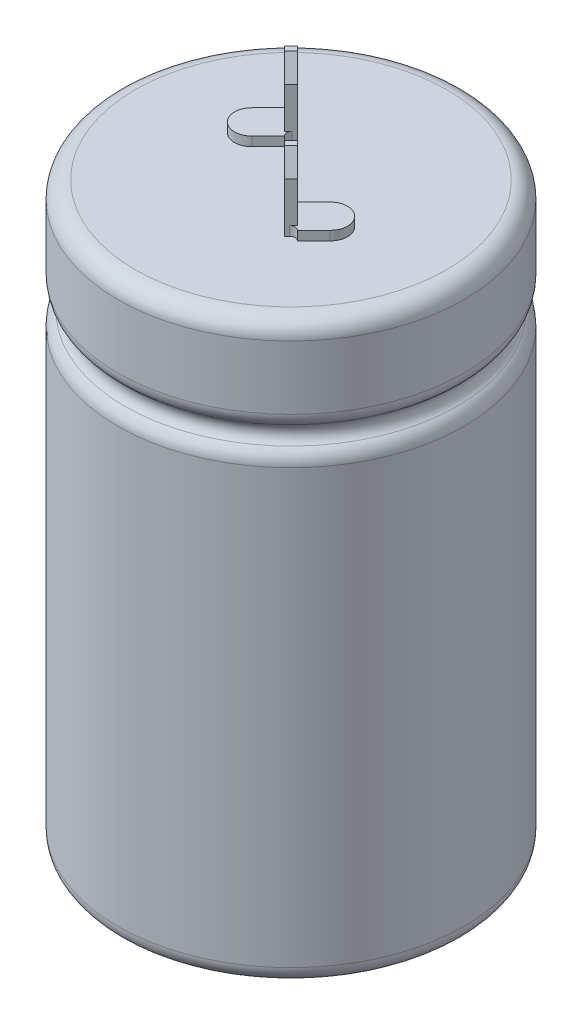
ISO-10303-21;
HEADER;
FILE_DESCRIPTION(('STEP AP214'),'2;1');
FILE_NAME('part.step','',(''),(''),'','','');
FILE_SCHEMA(('AUTOMOTIVE_DESIGN { 1 0 10303 214 1 1 1 1 }'));
ENDSEC;
DATA;
#1=APPLICATION_CONTEXT('core data for automotive mechanical design processes');
#2=APPLICATION_PROTOCOL_DEFINITION('international standard','automotive_design',2000,#1);
#3=PRODUCT_CONTEXT('',#1,'mechanical');
#4=PRODUCT('Part','Part','',(#3));
#5=PRODUCT_RELATED_PRODUCT_CATEGORY('part','',(#4));
#6=PRODUCT_DEFINITION_FORMATION('','',#4);
#7=PRODUCT_DEFINITION_CONTEXT('part definition',#1,'design');
#8=PRODUCT_DEFINITION('design','',#6,#7);
#9=PRODUCT_DEFINITION_SHAPE('','',#8);
#10=(LENGTH_UNIT() NAMED_UNIT(*) SI_UNIT(.MILLI.,.METRE.));
#11=(NAMED_UNIT(*) PLANE_ANGLE_UNIT() SI_UNIT($,.RADIAN.));
#12=(NAMED_UNIT(*) SI_UNIT($,.STERADIAN.) SOLID_ANGLE_UNIT());
#13=UNCERTAINTY_MEASURE_WITH_UNIT(LENGTH_MEASURE(1.E-05),#10,'distance_accuracy_value','');
#14=(GEOMETRIC_REPRESENTATION_CONTEXT(3) GLOBAL_UNCERTAINTY_ASSIGNED_CONTEXT((#13)) GLOBAL_UNIT_ASSIGNED_CONTEXT((#10,
#11,#12)) REPRESENTATION_CONTEXT('',''));
#15=CARTESIAN_POINT('',(0.,0.,0.));
#16=DIRECTION('',(0.,0.,1.));
#17=DIRECTION('',(1.,0.,0.));
#18=AXIS2_PLACEMENT_3D('',#15,#16,#17);
#19=CARTESIAN_POINT('',(4.52548339959411,56.3,3.95979797464446));
#20=DIRECTION('',(-0.707106781186544,0.,0.707106781186551));
#21=DIRECTION('',(0.707106781186551,0.,0.707106781186544));
#22=AXIS2_PLACEMENT_3D('',#19,#20,#21);
#23=PLANE('',#22);
#24=DIRECTION('',(-0.707106781186551,0.,-0.707106781186544));
#25=VECTOR('',#24,1.);
#26=CARTESIAN_POINT('',(4.52548339959411,56.3,3.95979797464446));
#27=LINE('',#26,#25);
#28=CARTESIAN_POINT('',(4.01075175799472,56.3,3.44506633304508));
#29=VERTEX_POINT('',#28);
#30=CARTESIAN_POINT('',(3.62600147882039,56.3,3.06031605387075));
#31=VERTEX_POINT('',#30);
#32=EDGE_CURVE('E265',#29,#31,#27,.T.);
#33=ORIENTED_EDGE('',*,*,#32,.F.);
#34=DIRECTION('',(0.241844762647975,-0.939692620785909,0.241844762647973));
#35=VECTOR('',#34,1.);
#36=CARTESIAN_POINT('',(4.01075175799472,56.3,3.44506633304508));
#37=LINE('',#36,#35);
#38=CARTESIAN_POINT('',(4.52548339959411,54.3,3.95979797464446));
#39=VERTEX_POINT('',#38);
#40=EDGE_CURVE('E344',#29,#39,#37,.T.);
#41=ORIENTED_EDGE('',*,*,#40,.T.);
#42=DIRECTION('',(0.,-1.,0.));
#43=VECTOR('',#42,1.);
#44=CARTESIAN_POINT('',(4.52548339959411,56.3,3.95979797464446));
#45=LINE('',#44,#43);
#46=CARTESIAN_POINT('',(4.52548339959414,50.8,3.95979797464443));
#47=VERTEX_POINT('',#46);
#48=EDGE_CURVE('E285',#39,#47,#45,.T.);
#49=ORIENTED_EDGE('',*,*,#48,.T.);
#50=DIRECTION('',(0.707106781186557,0.,0.707106781186538));
#51=VECTOR('',#50,1.);
#52=CARTESIAN_POINT('',(4.87903679018742,50.8,4.31335136523769));
#53=LINE('',#52,#51);
#54=CARTESIAN_POINT('',(3.11126983722103,50.8,2.54558441227135));
#55=VERTEX_POINT('',#54);
#56=EDGE_CURVE('E203',#55,#47,#53,.T.);
#57=ORIENTED_EDGE('',*,*,#56,.F.);
#58=DIRECTION('',(0.,-1.,0.));
#59=VECTOR('',#58,1.);
#60=CARTESIAN_POINT('',(3.11126983722101,56.3,2.54558441227137));
#61=LINE('',#60,#59);
#62=CARTESIAN_POINT('',(3.11126983722101,54.3,2.54558441227137));
#63=VERTEX_POINT('',#62);
#64=EDGE_CURVE('E283',#63,#55,#61,.T.);
#65=ORIENTED_EDGE('',*,*,#64,.F.);
#66=DIRECTION('',(0.241844762647976,0.939692620785909,0.241844762647974));
#67=VECTOR('',#66,1.);
#68=CARTESIAN_POINT('',(3.62600147882039,56.3,3.06031605387075));
#69=LINE('',#68,#67);
#70=EDGE_CURVE('E342',#63,#31,#69,.T.);
#71=ORIENTED_EDGE('',*,*,#70,.T.);
#72=EDGE_LOOP('',(#33,#41,#49,#57,#65,#71));
#73=FACE_BOUND('',#72,.T.);
#74=ADVANCED_FACE('F33',(#73),#23,.F.);
#75=CARTESIAN_POINT('',(-15.,50.,0.));
#76=DIRECTION('',(0.,-1.,0.));
#77=DIRECTION('',(0.,0.,-1.));
#78=AXIS2_PLACEMENT_3D('',#75,#76,#77);
#79=PLANE('',#78);
#80=DIRECTION('',(-0.707106781186544,0.,0.707106781186551));
#81=VECTOR('',#80,1.);
#82=CARTESIAN_POINT('',(2.54558441227177,50.,3.11126983722061));
#83=LINE('',#82,#81);
#84=CARTESIAN_POINT('',(2.75771644662775,50.,2.89913780286463));
#85=VERTEX_POINT('',#84);
#86=CARTESIAN_POINT('',(2.54558441227177,50.,3.11126983722061));
#87=VERTEX_POINT('',#86);
#88=EDGE_CURVE('E275',#85,#87,#83,.T.);
#89=ORIENTED_EDGE('',*,*,#88,.F.);
#90=CARTESIAN_POINT('',(2.40416305603448,50.,2.54558441227136));
#91=DIRECTION('',(0.,-1.,0.));
#92=DIRECTION('',(0.,0.,-1.));
#93=AXIS2_PLACEMENT_3D('',#90,#91,#92);
#94=CIRCLE('',#93,0.5);
#95=CARTESIAN_POINT('',(2.75771644662775,50.,2.19203102167808));
#96=VERTEX_POINT('',#95);
#97=EDGE_CURVE('E379',#85,#96,#94,.F.);
#98=ORIENTED_EDGE('',*,*,#97,.T.);
#99=DIRECTION('',(-0.707106781186538,0.,0.707106781186557));
#100=VECTOR('',#99,1.);
#101=CARTESIAN_POINT('',(2.75771644662775,50.,2.19203102167808));
#102=LINE('',#101,#100);
#103=CARTESIAN_POINT('',(4.17193000900083,50.,0.77781745930497));
#104=VERTEX_POINT('',#103);
#105=EDGE_CURVE('E211',#104,#96,#102,.T.);
#106=ORIENTED_EDGE('',*,*,#105,.F.);
#107=CARTESIAN_POINT('',(5.23259018078064,50.,1.8384776310848));
#108=DIRECTION('',(0.,1.,0.));
#109=DIRECTION('',(0.,0.,-1.));
#110=AXIS2_PLACEMENT_3D('',#107,#108,#109);
#111=CIRCLE('',#110,1.5);
#112=CARTESIAN_POINT('',(6.29325035256049,50.,2.89913780286458));
#113=VERTEX_POINT('',#112);
#114=EDGE_CURVE('E204',#113,#104,#111,.T.);
#115=ORIENTED_EDGE('',*,*,#114,.F.);
#116=DIRECTION('',(0.707106781186538,0.,-0.707106781186557));
#117=VECTOR('',#116,1.);
#118=CARTESIAN_POINT('',(4.87903679018742,50.,4.31335136523769));
#119=LINE('',#118,#117);
#120=CARTESIAN_POINT('',(4.87903679018742,50.,4.31335136523769));
#121=VERTEX_POINT('',#120);
#122=EDGE_CURVE('E421',#121,#113,#119,.T.);
#123=ORIENTED_EDGE('',*,*,#122,.F.);
#124=CARTESIAN_POINT('',(4.52548339959415,50.,4.66690475583097));
#125=DIRECTION('',(0.,-1.,0.));
#126=DIRECTION('',(0.,0.,-1.));
#127=AXIS2_PLACEMENT_3D('',#124,#125,#126);
#128=CIRCLE('',#127,0.5);
#129=CARTESIAN_POINT('',(4.17193000900087,50.,4.3133513652377));
#130=VERTEX_POINT('',#129);
#131=EDGE_CURVE('E377',#121,#130,#128,.F.);
#132=ORIENTED_EDGE('',*,*,#131,.T.);
#133=DIRECTION('',(0.707106781186543,0.,-0.707106781186552));
#134=VECTOR('',#133,1.);
#135=CARTESIAN_POINT('',(3.95979797464487,50.,4.5254833995937));
#136=LINE('',#135,#134);
#137=CARTESIAN_POINT('',(3.95979797464487,50.,4.5254833995937));
#138=VERTEX_POINT('',#137);
#139=EDGE_CURVE('E264',#138,#130,#136,.T.);
#140=ORIENTED_EDGE('',*,*,#139,.F.);
#141=DIRECTION('',(0.707106781186551,0.,0.707106781186544));
#142=VECTOR('',#141,1.);
#143=CARTESIAN_POINT('',(3.95979797464487,50.,4.5254833995937));
#144=LINE('',#143,#142);
#145=EDGE_CURVE('E269',#87,#138,#144,.T.);
#146=ORIENTED_EDGE('',*,*,#145,.F.);
#147=EDGE_LOOP('',(#89,#98,#106,#115,#123,#132,#140,#146));
#148=FACE_BOUND('',#147,.T.);
#149=CARTESIAN_POINT('',(0.,50.,0.));
#150=DIRECTION('',(0.,-1.,0.));
#151=DIRECTION('',(0.,0.,-1.));
#152=AXIS2_PLACEMENT_3D('',#149,#150,#151);
#153=CIRCLE('',#152,13.5);
#154=CARTESIAN_POINT('',(0.,50.,-13.5));
#155=VERTEX_POINT('',#154);
#156=EDGE_CURVE('E333',#155,#155,#153,.F.);
#157=ORIENTED_EDGE('',*,*,#156,.T.);
#158=EDGE_LOOP('',(#157));
#159=FACE_BOUND('',#158,.T.);
#160=DIRECTION('',(-0.707106781186503,0.,0.707106781186592));
#161=VECTOR('',#160,1.);
#162=CARTESIAN_POINT('',(-4.87903679018725,50.,-4.31335136523786));
#163=LINE('',#162,#161);
#164=CARTESIAN_POINT('',(-4.87903679018725,50.,-4.31335136523786));
#165=VERTEX_POINT('',#164);
#166=CARTESIAN_POINT('',(-6.29325035256026,50.,-2.89913780286467));
#167=VERTEX_POINT('',#166);
#168=EDGE_CURVE('E213',#165,#167,#163,.T.);
#169=ORIENTED_EDGE('',*,*,#168,.F.);
#170=CARTESIAN_POINT('',(-4.52548339959398,50.,-4.66690475583114));
#171=DIRECTION('',(0.,-1.,0.));
#172=DIRECTION('',(0.,0.,-1.));
#173=AXIS2_PLACEMENT_3D('',#170,#171,#172);
#174=CIRCLE('',#173,0.5);
#175=CARTESIAN_POINT('',(-4.17193000900071,50.,-4.31335136523786));
#176=VERTEX_POINT('',#175);
#177=EDGE_CURVE('E249',#165,#176,#174,.F.);
#178=ORIENTED_EDGE('',*,*,#177,.T.);
#179=DIRECTION('',(-0.707106781186543,0.,0.707106781186552));
#180=VECTOR('',#179,1.);
#181=CARTESIAN_POINT('',(-4.52548339959393,50.,-3.95979797464464));
#182=LINE('',#181,#180);
#183=CARTESIAN_POINT('',(-3.95979797464469,50.,-4.52548339959388));
#184=VERTEX_POINT('',#183);
#185=EDGE_CURVE('E288',#184,#176,#182,.T.);
#186=ORIENTED_EDGE('',*,*,#185,.F.);
#187=DIRECTION('',(-0.707106781186551,0.,-0.707106781186544));
#188=VECTOR('',#187,1.);
#189=CARTESIAN_POINT('',(-3.95979797464469,50.,-4.52548339959388));
#190=LINE('',#189,#188);
#191=CARTESIAN_POINT('',(-2.54558441227159,50.,-3.1112698372208));
#192=VERTEX_POINT('',#191);
#193=EDGE_CURVE('E293',#192,#184,#190,.T.);
#194=ORIENTED_EDGE('',*,*,#193,.F.);
#195=DIRECTION('',(0.707106781186544,0.,-0.707106781186551));
#196=VECTOR('',#195,1.);
#197=CARTESIAN_POINT('',(-3.11126983722082,50.,-2.54558441227155));
#198=LINE('',#197,#196);
#199=CARTESIAN_POINT('',(-2.7577164466275,50.,-2.89913780286489));
#200=VERTEX_POINT('',#199);
#201=EDGE_CURVE('E299',#200,#192,#198,.T.);
#202=ORIENTED_EDGE('',*,*,#201,.F.);
#203=CARTESIAN_POINT('',(-2.40416305603422,50.,-2.54558441227161));
#204=DIRECTION('',(0.,-1.,0.));
#205=DIRECTION('',(0.,0.,-1.));
#206=AXIS2_PLACEMENT_3D('',#203,#204,#205);
#207=CIRCLE('',#206,0.5);
#208=CARTESIAN_POINT('',(-2.75771644662749,50.,-2.19203102167834));
#209=VERTEX_POINT('',#208);
#210=EDGE_CURVE('E374',#200,#209,#207,.F.);
#211=ORIENTED_EDGE('',*,*,#210,.T.);
#212=DIRECTION('',(0.70710678118651,0.,-0.707106781186584));
#213=VECTOR('',#212,1.);
#214=CARTESIAN_POINT('',(-2.75771644662749,50.,-2.19203102167834));
#215=LINE('',#214,#213);
#216=CARTESIAN_POINT('',(-4.17193000900052,50.,-0.777817459305164));
#217=VERTEX_POINT('',#216);
#218=EDGE_CURVE('E246',#217,#209,#215,.T.);
#219=ORIENTED_EDGE('',*,*,#218,.F.);
#220=CARTESIAN_POINT('',(-5.23259018078039,50.,-1.83847763108492));
#221=DIRECTION('',(0.,1.,0.));
#222=DIRECTION('',(0.,0.,1.));
#223=AXIS2_PLACEMENT_3D('',#220,#221,#222);
#224=CIRCLE('',#223,1.49999999999999);
#225=EDGE_CURVE('E407',#167,#217,#224,.T.);
#226=ORIENTED_EDGE('',*,*,#225,.F.);
#227=EDGE_LOOP('',(#169,#178,#186,#194,#202,#211,#219,#226));
#228=FACE_BOUND('',#227,.T.);
#229=ADVANCED_FACE('F400',(#148,#159,#228),#79,.F.);
#230=CARTESIAN_POINT('',(0.,0.,0.));
#231=DIRECTION('',(0.,-1.,0.));
#232=DIRECTION('',(0.,0.,-1.));
#233=AXIS2_PLACEMENT_3D('',#230,#231,#232);
#234=CYLINDRICAL_SURFACE('',#233,15.);
#235=CARTESIAN_POINT('',(0.,43.,0.));
#236=DIRECTION('',(0.,1.,0.));
#237=DIRECTION('',(0.,0.,1.));
#238=AXIS2_PLACEMENT_3D('',#235,#236,#237);
#239=CIRCLE('',#238,15.);
#240=CARTESIAN_POINT('',(0.,43.,15.));
#241=VERTEX_POINT('',#240);
#242=EDGE_CURVE('E321',#241,#241,#239,.T.);
#243=ORIENTED_EDGE('',*,*,#242,.T.);
#244=EDGE_LOOP('',(#243));
#245=FACE_BOUND('',#244,.T.);
#246=CARTESIAN_POINT('',(0.,48.5,0.));
#247=DIRECTION('',(0.,-1.,0.));
#248=DIRECTION('',(0.,0.,-1.));
#249=AXIS2_PLACEMENT_3D('',#246,#247,#248);
#250=CIRCLE('',#249,15.);
#251=CARTESIAN_POINT('',(0.,48.5,-15.));
#252=VERTEX_POINT('',#251);
#253=EDGE_CURVE('E318',#252,#252,#250,.T.);
#254=ORIENTED_EDGE('',*,*,#253,.T.);
#255=EDGE_LOOP('',(#254));
#256=FACE_BOUND('',#255,.T.);
#257=ADVANCED_FACE('F484',(#245,#256),#234,.T.);
#258=CARTESIAN_POINT('',(0.,41.,0.));
#259=DIRECTION('',(0.,-1.,0.));
#260=DIRECTION('',(0.,0.,-1.));
#261=AXIS2_PLACEMENT_3D('',#258,#259,#260);
#262=TOROIDAL_SURFACE('',#261,15.,0.999999999999997);
#263=CARTESIAN_POINT('',(0.,41.8,0.));
#264=DIRECTION('',(0.,-1.,0.));
#265=DIRECTION('',(0.,0.,-1.));
#266=AXIS2_PLACEMENT_3D('',#263,#264,#265);
#267=CIRCLE('',#266,14.4);
#268=CARTESIAN_POINT('',(0.,41.8,-14.4));
#269=VERTEX_POINT('',#268);
#270=EDGE_CURVE('E315',#269,#269,#267,.T.);
#271=ORIENTED_EDGE('',*,*,#270,.T.);
#272=EDGE_LOOP('',(#271));
#273=FACE_BOUND('',#272,.T.);
#274=CARTESIAN_POINT('',(0.,40.2,0.));
#275=DIRECTION('',(0.,1.,0.));
#276=DIRECTION('',(0.,0.,1.));
#277=AXIS2_PLACEMENT_3D('',#274,#275,#276);
#278=CIRCLE('',#277,14.4);
#279=CARTESIAN_POINT('',(0.,40.2,14.4));
#280=VERTEX_POINT('',#279);
#281=EDGE_CURVE('E312',#280,#280,#278,.T.);
#282=ORIENTED_EDGE('',*,*,#281,.T.);
#283=EDGE_LOOP('',(#282));
#284=FACE_BOUND('',#283,.T.);
#285=ADVANCED_FACE('F518',(#273,#284),#262,.F.);
#286=CARTESIAN_POINT('',(0.,0.,0.));
#287=DIRECTION('',(0.,-1.,0.));
#288=DIRECTION('',(0.,0.,-1.));
#289=AXIS2_PLACEMENT_3D('',#286,#287,#288);
#290=CYLINDRICAL_SURFACE('',#289,15.);
#291=CARTESIAN_POINT('',(0.,39.,0.));
#292=DIRECTION('',(0.,1.,0.));
#293=DIRECTION('',(0.,0.,1.));
#294=AXIS2_PLACEMENT_3D('',#291,#292,#293);
#295=CIRCLE('',#294,15.);
#296=CARTESIAN_POINT('',(0.,39.,15.));
#297=VERTEX_POINT('',#296);
#298=EDGE_CURVE('E327',#297,#297,#295,.F.);
#299=ORIENTED_EDGE('',*,*,#298,.T.);
#300=EDGE_LOOP('',(#299));
#301=FACE_BOUND('',#300,.T.);
#302=CARTESIAN_POINT('',(0.,1.5,0.));
#303=DIRECTION('',(0.,1.,0.));
#304=DIRECTION('',(0.,0.,1.));
#305=AXIS2_PLACEMENT_3D('',#302,#303,#304);
#306=CIRCLE('',#305,15.);
#307=CARTESIAN_POINT('',(0.,1.5,15.));
#308=VERTEX_POINT('',#307);
#309=EDGE_CURVE('E324',#308,#308,#306,.T.);
#310=ORIENTED_EDGE('',*,*,#309,.T.);
#311=EDGE_LOOP('',(#310));
#312=FACE_BOUND('',#311,.T.);
#313=ADVANCED_FACE('F514',(#301,#312),#290,.T.);
#314=CARTESIAN_POINT('',(0.,0.,0.));
#315=DIRECTION('',(0.,1.,0.));
#316=DIRECTION('',(0.,0.,1.));
#317=AXIS2_PLACEMENT_3D('',#314,#315,#316);
#318=PLANE('',#317);
#319=CARTESIAN_POINT('',(0.,0.,0.));
#320=DIRECTION('',(0.,1.,0.));
#321=DIRECTION('',(0.,0.,1.));
#322=AXIS2_PLACEMENT_3D('',#319,#320,#321);
#323=CIRCLE('',#322,13.5);
#324=CARTESIAN_POINT('',(0.,0.,13.5));
#325=VERTEX_POINT('',#324);
#326=EDGE_CURVE('E330',#325,#325,#323,.F.);
#327=ORIENTED_EDGE('',*,*,#326,.T.);
#328=EDGE_LOOP('',(#327));
#329=FACE_BOUND('',#328,.T.);
#330=ADVANCED_FACE('F510',(#329),#318,.F.);
#331=CARTESIAN_POINT('',(0.,43.,0.));
#332=DIRECTION('',(0.,1.,0.));
#333=DIRECTION('',(0.,0.,1.));
#334=AXIS2_PLACEMENT_3D('',#331,#332,#333);
#335=TOROIDAL_SURFACE('',#334,13.5,1.5);
#336=ORIENTED_EDGE('',*,*,#242,.F.);
#337=EDGE_LOOP('',(#336));
#338=FACE_BOUND('',#337,.T.);
#339=ORIENTED_EDGE('',*,*,#270,.F.);
#340=EDGE_LOOP('',(#339));
#341=FACE_BOUND('',#340,.T.);
#342=ADVANCED_FACE('F513',(#338,#341),#335,.T.);
#343=CARTESIAN_POINT('',(0.,39.,0.));
#344=DIRECTION('',(0.,1.,0.));
#345=DIRECTION('',(0.,0.,1.));
#346=AXIS2_PLACEMENT_3D('',#343,#344,#345);
#347=TOROIDAL_SURFACE('',#346,13.5,1.5);
#348=ORIENTED_EDGE('',*,*,#281,.F.);
#349=EDGE_LOOP('',(#348));
#350=FACE_BOUND('',#349,.T.);
#351=ORIENTED_EDGE('',*,*,#298,.F.);
#352=EDGE_LOOP('',(#351));
#353=FACE_BOUND('',#352,.T.);
#354=ADVANCED_FACE('F528',(#350,#353),#347,.T.);
#355=CARTESIAN_POINT('',(0.,1.5,0.));
#356=DIRECTION('',(0.,1.,0.));
#357=DIRECTION('',(0.,0.,1.));
#358=AXIS2_PLACEMENT_3D('',#355,#356,#357);
#359=TOROIDAL_SURFACE('',#358,13.5,1.5);
#360=ORIENTED_EDGE('',*,*,#309,.F.);
#361=EDGE_LOOP('',(#360));
#362=FACE_BOUND('',#361,.T.);
#363=ORIENTED_EDGE('',*,*,#326,.F.);
#364=EDGE_LOOP('',(#363));
#365=FACE_BOUND('',#364,.T.);
#366=ADVANCED_FACE('F532',(#362,#365),#359,.T.);
#367=CARTESIAN_POINT('',(0.,48.5,0.));
#368=DIRECTION('',(0.,-1.,0.));
#369=DIRECTION('',(0.,0.,-1.));
#370=AXIS2_PLACEMENT_3D('',#367,#368,#369);
#371=TOROIDAL_SURFACE('',#370,13.5,1.5);
#372=ORIENTED_EDGE('',*,*,#156,.F.);
#373=EDGE_LOOP('',(#372));
#374=FACE_BOUND('',#373,.T.);
#375=ORIENTED_EDGE('',*,*,#253,.F.);
#376=EDGE_LOOP('',(#375));
#377=FACE_BOUND('',#376,.T.);
#378=ADVANCED_FACE('F508',(#374,#377),#371,.T.);
#379=CARTESIAN_POINT('',(-4.52548339959393,56.3,-3.95979797464464));
#380=DIRECTION('',(0.707106781186552,0.,0.707106781186543));
#381=DIRECTION('',(0.707106781186543,0.,-0.707106781186552));
#382=AXIS2_PLACEMENT_3D('',#379,#380,#381);
#383=PLANE('',#382);
#384=ORIENTED_EDGE('',*,*,#185,.T.);
#385=DIRECTION('',(0.,-1.,0.));
#386=VECTOR('',#385,1.);
#387=CARTESIAN_POINT('',(-4.17193000900071,50.8,-4.31335136523786));
#388=LINE('',#387,#386);
#389=CARTESIAN_POINT('',(-4.17193000900071,50.8,-4.31335136523786));
#390=VERTEX_POINT('',#389);
#391=EDGE_CURVE('E387',#176,#390,#388,.F.);
#392=ORIENTED_EDGE('',*,*,#391,.T.);
#393=DIRECTION('',(-0.707106781186543,0.,0.707106781186552));
#394=VECTOR('',#393,1.);
#395=CARTESIAN_POINT('',(-4.52548339959393,50.8,-3.95979797464464));
#396=LINE('',#395,#394);
#397=CARTESIAN_POINT('',(-4.52548339959396,50.8,-3.95979797464461));
#398=VERTEX_POINT('',#397);
#399=EDGE_CURVE('E233',#390,#398,#396,.T.);
#400=ORIENTED_EDGE('',*,*,#399,.T.);
#401=DIRECTION('',(0.,-1.,0.));
#402=VECTOR('',#401,1.);
#403=CARTESIAN_POINT('',(-4.52548339959393,56.3,-3.95979797464464));
#404=LINE('',#403,#402);
#405=CARTESIAN_POINT('',(-4.52548339959393,54.3,-3.95979797464464));
#406=VERTEX_POINT('',#405);
#407=EDGE_CURVE('E309',#406,#398,#404,.T.);
#408=ORIENTED_EDGE('',*,*,#407,.F.);
#409=DIRECTION('',(0.707106781186543,0.,-0.707106781186552));
#410=VECTOR('',#409,1.);
#411=CARTESIAN_POINT('',(-4.52548339959393,54.3,-3.95979797464464));
#412=LINE('',#411,#410);
#413=CARTESIAN_POINT('',(-3.95979797464469,54.3,-4.52548339959388));
#414=VERTEX_POINT('',#413);
#415=EDGE_CURVE('E364',#406,#414,#412,.T.);
#416=ORIENTED_EDGE('',*,*,#415,.T.);
#417=DIRECTION('',(0.,-1.,0.));
#418=VECTOR('',#417,1.);
#419=CARTESIAN_POINT('',(-3.95979797464469,56.3,-4.52548339959388));
#420=LINE('',#419,#418);
#421=EDGE_CURVE('E296',#414,#184,#420,.T.);
#422=ORIENTED_EDGE('',*,*,#421,.T.);
#423=EDGE_LOOP('',(#384,#392,#400,#408,#416,#422));
#424=FACE_BOUND('',#423,.T.);
#425=ADVANCED_FACE('F504',(#424),#383,.F.);
#426=CARTESIAN_POINT('',(-4.52548339959393,56.3,-3.95979797464464));
#427=DIRECTION('',(0.707106781186544,0.,-0.707106781186551));
#428=DIRECTION('',(-0.707106781186551,0.,-0.707106781186544));
#429=AXIS2_PLACEMENT_3D('',#426,#427,#428);
#430=PLANE('',#429);
#431=DIRECTION('',(0.707106781186551,0.,0.707106781186544));
#432=VECTOR('',#431,1.);
#433=CARTESIAN_POINT('',(-4.52548339959393,56.3,-3.95979797464464));
#434=LINE('',#433,#432);
#435=CARTESIAN_POINT('',(-4.01075175799454,56.3,-3.44506633304527));
#436=VERTEX_POINT('',#435);
#437=CARTESIAN_POINT('',(-3.62600147882021,56.3,-3.06031605387093));
#438=VERTEX_POINT('',#437);
#439=EDGE_CURVE('E289',#436,#438,#434,.T.);
#440=ORIENTED_EDGE('',*,*,#439,.F.);
#441=DIRECTION('',(0.241844762647976,0.939692620785909,0.241844762647973));
#442=VECTOR('',#441,1.);
#443=CARTESIAN_POINT('',(-4.01075175799454,56.3,-3.44506633304527));
#444=LINE('',#443,#442);
#445=EDGE_CURVE('E362',#436,#406,#444,.F.);
#446=ORIENTED_EDGE('',*,*,#445,.T.);
#447=ORIENTED_EDGE('',*,*,#407,.T.);
#448=DIRECTION('',(-0.707106781186588,0.,-0.707106781186507));
#449=VECTOR('',#448,1.);
#450=CARTESIAN_POINT('',(-2.75771644662749,50.8,-2.19203102167834));
#451=LINE('',#450,#449);
#452=CARTESIAN_POINT('',(-3.11126983722079,50.8,-2.54558441227159));
#453=VERTEX_POINT('',#452);
#454=EDGE_CURVE('E251',#453,#398,#451,.T.);
#455=ORIENTED_EDGE('',*,*,#454,.F.);
#456=DIRECTION('',(0.,-1.,0.));
#457=VECTOR('',#456,1.);
#458=CARTESIAN_POINT('',(-3.11126983722082,56.3,-2.54558441227155));
#459=LINE('',#458,#457);
#460=CARTESIAN_POINT('',(-3.11126983722082,54.3,-2.54558441227155));
#461=VERTEX_POINT('',#460);
#462=EDGE_CURVE('E307',#461,#453,#459,.T.);
#463=ORIENTED_EDGE('',*,*,#462,.F.);
#464=DIRECTION('',(0.241844762647976,-0.939692620785909,0.241844762647974));
#465=VECTOR('',#464,1.);
#466=CARTESIAN_POINT('',(-3.62600147882021,56.3,-3.06031605387093));
#467=LINE('',#466,#465);
#468=EDGE_CURVE('E360',#461,#438,#467,.F.);
#469=ORIENTED_EDGE('',*,*,#468,.T.);
#470=EDGE_LOOP('',(#440,#446,#447,#455,#463,#469));
#471=FACE_BOUND('',#470,.T.);
#472=ADVANCED_FACE('F501',(#471),#430,.F.);
#473=CARTESIAN_POINT('',(-3.11126983722082,56.3,-2.54558441227155));
#474=DIRECTION('',(-0.707106781186551,0.,-0.707106781186544));
#475=DIRECTION('',(-0.707106781186544,0.,0.707106781186551));
#476=AXIS2_PLACEMENT_3D('',#473,#474,#475);
#477=PLANE('',#476);
#478=DIRECTION('',(0.707106781186544,0.,-0.707106781186551));
#479=VECTOR('',#478,1.);
#480=CARTESIAN_POINT('',(-3.11126983722082,50.8,-2.54558441227155));
#481=LINE('',#480,#479);
#482=CARTESIAN_POINT('',(-2.7577164466275,50.8,-2.89913780286489));
#483=VERTEX_POINT('',#482);
#484=EDGE_CURVE('E47',#453,#483,#481,.T.);
#485=ORIENTED_EDGE('',*,*,#484,.T.);
#486=DIRECTION('',(0.,-1.,0.));
#487=VECTOR('',#486,1.);
#488=CARTESIAN_POINT('',(-2.7577164466275,50.,-2.89913780286489));
#489=LINE('',#488,#487);
#490=EDGE_CURVE('E221',#483,#200,#489,.T.);
#491=ORIENTED_EDGE('',*,*,#490,.T.);
#492=ORIENTED_EDGE('',*,*,#201,.T.);
#493=DIRECTION('',(0.,-1.,0.));
#494=VECTOR('',#493,1.);
#495=CARTESIAN_POINT('',(-2.54558441227159,56.3,-3.1112698372208));
#496=LINE('',#495,#494);
#497=CARTESIAN_POINT('',(-2.54558441227159,54.3,-3.1112698372208));
#498=VERTEX_POINT('',#497);
#499=EDGE_CURVE('E304',#498,#192,#496,.T.);
#500=ORIENTED_EDGE('',*,*,#499,.F.);
#501=DIRECTION('',(-0.707106781186544,0.,0.707106781186551));
#502=VECTOR('',#501,1.);
#503=CARTESIAN_POINT('',(-3.11126983722082,54.3,-2.54558441227155));
#504=LINE('',#503,#502);
#505=EDGE_CURVE('E370',#498,#461,#504,.T.);
#506=ORIENTED_EDGE('',*,*,#505,.T.);
#507=ORIENTED_EDGE('',*,*,#462,.T.);
#508=EDGE_LOOP('',(#485,#491,#492,#500,#506,#507));
#509=FACE_BOUND('',#508,.T.);
#510=ADVANCED_FACE('F390',(#509),#477,.F.);
#511=CARTESIAN_POINT('',(-3.95979797464469,56.3,-4.52548339959388));
#512=DIRECTION('',(-0.707106781186544,0.,0.707106781186551));
#513=DIRECTION('',(0.707106781186551,0.,0.707106781186544));
#514=AXIS2_PLACEMENT_3D('',#511,#512,#513);
#515=PLANE('',#514);
#516=ORIENTED_EDGE('',*,*,#421,.F.);
#517=DIRECTION('',(-0.241844762647976,-0.939692620785909,-0.241844762647974));
#518=VECTOR('',#517,1.);
#519=CARTESIAN_POINT('',(-3.44506633304531,56.3,-4.01075175799451));
#520=LINE('',#519,#518);
#521=CARTESIAN_POINT('',(-3.44506633304531,56.3,-4.01075175799451));
#522=VERTEX_POINT('',#521);
#523=EDGE_CURVE('E368',#414,#522,#520,.F.);
#524=ORIENTED_EDGE('',*,*,#523,.T.);
#525=DIRECTION('',(-0.707106781186551,0.,-0.707106781186544));
#526=VECTOR('',#525,1.);
#527=CARTESIAN_POINT('',(-3.95979797464469,56.3,-4.52548339959388));
#528=LINE('',#527,#526);
#529=CARTESIAN_POINT('',(-3.06031605387097,56.3,-3.62600147882018));
#530=VERTEX_POINT('',#529);
#531=EDGE_CURVE('E292',#530,#522,#528,.T.);
#532=ORIENTED_EDGE('',*,*,#531,.F.);
#533=DIRECTION('',(-0.241844762647976,0.939692620785909,-0.241844762647974));
#534=VECTOR('',#533,1.);
#535=CARTESIAN_POINT('',(-3.06031605387097,56.3,-3.62600147882018));
#536=LINE('',#535,#534);
#537=EDGE_CURVE('E366',#530,#498,#536,.F.);
#538=ORIENTED_EDGE('',*,*,#537,.T.);
#539=ORIENTED_EDGE('',*,*,#499,.T.);
#540=ORIENTED_EDGE('',*,*,#193,.T.);
#541=EDGE_LOOP('',(#516,#524,#532,#538,#539,#540));
#542=FACE_BOUND('',#541,.T.);
#543=ADVANCED_FACE('F494',(#542),#515,.F.);
#544=CARTESIAN_POINT('',(0.,56.3,0.));
#545=DIRECTION('',(0.,-1.,0.));
#546=DIRECTION('',(0.,0.,-1.));
#547=AXIS2_PLACEMENT_3D('',#544,#545,#546);
#548=PLANE('',#547);
#549=ORIENTED_EDGE('',*,*,#531,.T.);
#550=DIRECTION('',(-0.707106781186543,0.,0.707106781186552));
#551=VECTOR('',#550,1.);
#552=CARTESIAN_POINT('',(-3.72790904551993,56.3,-3.72790904551988));
#553=LINE('',#552,#551);
#554=EDGE_CURVE('E357',#522,#436,#553,.T.);
#555=ORIENTED_EDGE('',*,*,#554,.T.);
#556=ORIENTED_EDGE('',*,*,#439,.T.);
#557=DIRECTION('',(0.707106781186544,0.,-0.707106781186551));
#558=VECTOR('',#557,1.);
#559=CARTESIAN_POINT('',(-3.34315876634559,56.3,-3.34315876634555));
#560=LINE('',#559,#558);
#561=EDGE_CURVE('E354',#438,#530,#560,.T.);
#562=ORIENTED_EDGE('',*,*,#561,.T.);
#563=EDGE_LOOP('',(#549,#555,#556,#562));
#564=FACE_BOUND('',#563,.T.);
#565=ADVANCED_FACE('F491',(#564),#548,.F.);
#566=CARTESIAN_POINT('',(3.95979797464487,56.3,4.5254833995937));
#567=DIRECTION('',(-0.707106781186552,0.,-0.707106781186543));
#568=DIRECTION('',(-0.707106781186543,0.,0.707106781186552));
#569=AXIS2_PLACEMENT_3D('',#566,#567,#568);
#570=PLANE('',#569);
#571=ORIENTED_EDGE('',*,*,#139,.T.);
#572=DIRECTION('',(0.,-1.,0.));
#573=VECTOR('',#572,1.);
#574=CARTESIAN_POINT('',(4.17193000900087,50.8,4.3133513652377));
#575=LINE('',#574,#573);
#576=CARTESIAN_POINT('',(4.17193000900087,50.8,4.3133513652377));
#577=VERTEX_POINT('',#576);
#578=EDGE_CURVE('E383',#130,#577,#575,.F.);
#579=ORIENTED_EDGE('',*,*,#578,.T.);
#580=DIRECTION('',(0.707106781186543,0.,-0.707106781186552));
#581=VECTOR('',#580,1.);
#582=CARTESIAN_POINT('',(5.93969696196719,50.8,2.54558441227135));
#583=LINE('',#582,#581);
#584=EDGE_CURVE('E381',#577,#47,#583,.T.);
#585=ORIENTED_EDGE('',*,*,#584,.T.);
#586=ORIENTED_EDGE('',*,*,#48,.F.);
#587=DIRECTION('',(-0.707106781186543,0.,0.707106781186552));
#588=VECTOR('',#587,1.);
#589=CARTESIAN_POINT('',(3.95979797464487,54.3,4.5254833995937));
#590=LINE('',#589,#588);
#591=CARTESIAN_POINT('',(3.95979797464487,54.3,4.5254833995937));
#592=VERTEX_POINT('',#591);
#593=EDGE_CURVE('E346',#39,#592,#590,.T.);
#594=ORIENTED_EDGE('',*,*,#593,.T.);
#595=DIRECTION('',(0.,-1.,0.));
#596=VECTOR('',#595,1.);
#597=CARTESIAN_POINT('',(3.95979797464487,56.3,4.5254833995937));
#598=LINE('',#597,#596);
#599=EDGE_CURVE('E272',#592,#138,#598,.T.);
#600=ORIENTED_EDGE('',*,*,#599,.T.);
#601=EDGE_LOOP('',(#571,#579,#585,#586,#594,#600));
#602=FACE_BOUND('',#601,.T.);
#603=ADVANCED_FACE('F435',(#602),#570,.F.);
#604=CARTESIAN_POINT('',(2.54558441227177,56.3,3.11126983722061));
#605=DIRECTION('',(0.707106781186551,0.,0.707106781186544));
#606=DIRECTION('',(0.707106781186544,0.,-0.707106781186551));
#607=AXIS2_PLACEMENT_3D('',#604,#605,#606);
#608=PLANE('',#607);
#609=DIRECTION('',(-0.707106781186544,0.,0.707106781186551));
#610=VECTOR('',#609,1.);
#611=CARTESIAN_POINT('',(4.52548339959409,50.8,1.13137084989827));
#612=LINE('',#611,#610);
#613=CARTESIAN_POINT('',(2.75771644662775,50.8,2.89913780286463));
#614=VERTEX_POINT('',#613);
#615=EDGE_CURVE('E55',#55,#614,#612,.T.);
#616=ORIENTED_EDGE('',*,*,#615,.T.);
#617=DIRECTION('',(0.,-1.,0.));
#618=VECTOR('',#617,1.);
#619=CARTESIAN_POINT('',(2.75771644662775,50.,2.89913780286463));
#620=LINE('',#619,#618);
#621=EDGE_CURVE('E219',#614,#85,#620,.T.);
#622=ORIENTED_EDGE('',*,*,#621,.T.);
#623=ORIENTED_EDGE('',*,*,#88,.T.);
#624=DIRECTION('',(0.,-1.,0.));
#625=VECTOR('',#624,1.);
#626=CARTESIAN_POINT('',(2.54558441227177,56.3,3.11126983722061));
#627=LINE('',#626,#625);
#628=CARTESIAN_POINT('',(2.54558441227177,54.3,3.11126983722061));
#629=VERTEX_POINT('',#628);
#630=EDGE_CURVE('E280',#629,#87,#627,.T.);
#631=ORIENTED_EDGE('',*,*,#630,.F.);
#632=DIRECTION('',(0.707106781186544,0.,-0.707106781186551));
#633=VECTOR('',#632,1.);
#634=CARTESIAN_POINT('',(3.11126983722101,54.3,2.54558441227137));
#635=LINE('',#634,#633);
#636=EDGE_CURVE('E352',#629,#63,#635,.T.);
#637=ORIENTED_EDGE('',*,*,#636,.T.);
#638=ORIENTED_EDGE('',*,*,#64,.T.);
#639=EDGE_LOOP('',(#616,#622,#623,#631,#637,#638));
#640=FACE_BOUND('',#639,.T.);
#641=ADVANCED_FACE('F453',(#640),#608,.F.);
#642=CARTESIAN_POINT('',(3.95979797464487,56.3,4.5254833995937));
#643=DIRECTION('',(0.707106781186544,0.,-0.707106781186551));
#644=DIRECTION('',(-0.707106781186551,0.,-0.707106781186544));
#645=AXIS2_PLACEMENT_3D('',#642,#643,#644);
#646=PLANE('',#645);
#647=ORIENTED_EDGE('',*,*,#599,.F.);
#648=DIRECTION('',(-0.241844762647975,0.939692620785909,-0.241844762647973));
#649=VECTOR('',#648,1.);
#650=CARTESIAN_POINT('',(3.44506633304549,56.3,4.01075175799432));
#651=LINE('',#650,#649);
#652=CARTESIAN_POINT('',(3.44506633304549,56.3,4.01075175799432));
#653=VERTEX_POINT('',#652);
#654=EDGE_CURVE('E350',#592,#653,#651,.T.);
#655=ORIENTED_EDGE('',*,*,#654,.T.);
#656=DIRECTION('',(0.707106781186551,0.,0.707106781186544));
#657=VECTOR('',#656,1.);
#658=CARTESIAN_POINT('',(3.95979797464487,56.3,4.5254833995937));
#659=LINE('',#658,#657);
#660=CARTESIAN_POINT('',(3.06031605387116,56.3,3.62600147881999));
#661=VERTEX_POINT('',#660);
#662=EDGE_CURVE('E268',#661,#653,#659,.T.);
#663=ORIENTED_EDGE('',*,*,#662,.F.);
#664=DIRECTION('',(-0.241844762647976,-0.939692620785909,-0.241844762647974));
#665=VECTOR('',#664,1.);
#666=CARTESIAN_POINT('',(3.06031605387116,56.3,3.62600147881999));
#667=LINE('',#666,#665);
#668=EDGE_CURVE('E348',#661,#629,#667,.T.);
#669=ORIENTED_EDGE('',*,*,#668,.T.);
#670=ORIENTED_EDGE('',*,*,#630,.T.);
#671=ORIENTED_EDGE('',*,*,#145,.T.);
#672=EDGE_LOOP('',(#647,#655,#663,#669,#670,#671));
#673=FACE_BOUND('',#672,.T.);
#674=ADVANCED_FACE('F443',(#673),#646,.F.);
#675=CARTESIAN_POINT('',(0.,56.3,0.));
#676=DIRECTION('',(0.,1.,0.));
#677=DIRECTION('',(0.,0.,1.));
#678=AXIS2_PLACEMENT_3D('',#675,#676,#677);
#679=PLANE('',#678);
#680=ORIENTED_EDGE('',*,*,#662,.T.);
#681=DIRECTION('',(0.707106781186543,0.,-0.707106781186552));
#682=VECTOR('',#681,1.);
#683=CARTESIAN_POINT('',(4.01075175799472,56.3,3.44506633304508));
#684=LINE('',#683,#682);
#685=EDGE_CURVE('E339',#653,#29,#684,.T.);
#686=ORIENTED_EDGE('',*,*,#685,.T.);
#687=ORIENTED_EDGE('',*,*,#32,.T.);
#688=DIRECTION('',(-0.707106781186544,0.,0.707106781186551));
#689=VECTOR('',#688,1.);
#690=CARTESIAN_POINT('',(3.06031605387116,56.3,3.62600147881999));
#691=LINE('',#690,#689);
#692=EDGE_CURVE('E336',#31,#661,#691,.T.);
#693=ORIENTED_EDGE('',*,*,#692,.T.);
#694=EDGE_LOOP('',(#680,#686,#687,#693));
#695=FACE_BOUND('',#694,.T.);
#696=ADVANCED_FACE('F445',(#695),#679,.T.);
#697=CARTESIAN_POINT('',(-4.87903679018725,50.8,-4.31335136523786));
#698=DIRECTION('',(0.707106781186592,0.,0.707106781186503));
#699=DIRECTION('',(0.707106781186503,0.,-0.707106781186592));
#700=AXIS2_PLACEMENT_3D('',#697,#698,#699);
#701=PLANE('',#700);
#702=ORIENTED_EDGE('',*,*,#168,.T.);
#703=DIRECTION('',(0.,-1.,0.));
#704=VECTOR('',#703,1.);
#705=CARTESIAN_POINT('',(-6.29325035256026,50.8,-2.89913780286467));
#706=LINE('',#705,#704);
#707=CARTESIAN_POINT('',(-6.29325035256026,50.8,-2.89913780286467));
#708=VERTEX_POINT('',#707);
#709=EDGE_CURVE('E244',#708,#167,#706,.T.);
#710=ORIENTED_EDGE('',*,*,#709,.F.);
#711=DIRECTION('',(-0.707106781186503,0.,0.707106781186592));
#712=VECTOR('',#711,1.);
#713=CARTESIAN_POINT('',(-4.87903679018725,50.8,-4.31335136523786));
#714=LINE('',#713,#712);
#715=CARTESIAN_POINT('',(-4.87903679018725,50.8,-4.31335136523786));
#716=VERTEX_POINT('',#715);
#717=EDGE_CURVE('E231',#716,#708,#714,.T.);
#718=ORIENTED_EDGE('',*,*,#717,.F.);
#719=DIRECTION('',(0.,-1.,0.));
#720=VECTOR('',#719,1.);
#721=CARTESIAN_POINT('',(-4.87903679018725,50.8,-4.31335136523786));
#722=LINE('',#721,#720);
#723=EDGE_CURVE('E242',#716,#165,#722,.T.);
#724=ORIENTED_EDGE('',*,*,#723,.T.);
#725=EDGE_LOOP('',(#702,#710,#718,#724));
#726=FACE_BOUND('',#725,.T.);
#727=ADVANCED_FACE('F241',(#726),#701,.F.);
#728=CARTESIAN_POINT('',(-5.23259018078039,50.8,-1.83847763108492));
#729=DIRECTION('',(0.,-1.,0.));
#730=DIRECTION('',(0.,0.,-1.));
#731=AXIS2_PLACEMENT_3D('',#728,#729,#730);
#732=CYLINDRICAL_SURFACE('',#731,1.49999999999999);
#733=ORIENTED_EDGE('',*,*,#225,.T.);
#734=DIRECTION('',(0.,-1.,0.));
#735=VECTOR('',#734,1.);
#736=CARTESIAN_POINT('',(-4.17193000900052,50.8,-0.777817459305164));
#737=LINE('',#736,#735);
#738=CARTESIAN_POINT('',(-4.17193000900052,50.8,-0.777817459305164));
#739=VERTEX_POINT('',#738);
#740=EDGE_CURVE('E254',#739,#217,#737,.T.);
#741=ORIENTED_EDGE('',*,*,#740,.F.);
#742=CARTESIAN_POINT('',(-5.23259018078039,50.8,-1.83847763108492));
#743=DIRECTION('',(0.,1.,0.));
#744=DIRECTION('',(0.,0.,1.));
#745=AXIS2_PLACEMENT_3D('',#742,#743,#744);
#746=CIRCLE('',#745,1.49999999999999);
#747=EDGE_CURVE('E245',#708,#739,#746,.T.);
#748=ORIENTED_EDGE('',*,*,#747,.F.);
#749=ORIENTED_EDGE('',*,*,#709,.T.);
#750=EDGE_LOOP('',(#733,#741,#748,#749));
#751=FACE_BOUND('',#750,.T.);
#752=ADVANCED_FACE('F617',(#751),#732,.T.);
#753=CARTESIAN_POINT('',(-2.75771644662749,50.8,-2.19203102167834));
#754=DIRECTION('',(-0.707106781186584,0.,-0.70710678118651));
#755=DIRECTION('',(-0.707106781186511,0.,0.707106781186585));
#756=AXIS2_PLACEMENT_3D('',#753,#754,#755);
#757=PLANE('',#756);
#758=ORIENTED_EDGE('',*,*,#218,.T.);
#759=DIRECTION('',(0.,-1.,0.));
#760=VECTOR('',#759,1.);
#761=CARTESIAN_POINT('',(-2.75771644662749,50.8,-2.19203102167834));
#762=LINE('',#761,#760);
#763=CARTESIAN_POINT('',(-2.75771644662749,50.8,-2.19203102167834));
#764=VERTEX_POINT('',#763);
#765=EDGE_CURVE('E250',#764,#209,#762,.T.);
#766=ORIENTED_EDGE('',*,*,#765,.F.);
#767=DIRECTION('',(0.70710678118651,0.,-0.707106781186584));
#768=VECTOR('',#767,1.);
#769=CARTESIAN_POINT('',(-2.75771644662749,50.8,-2.19203102167834));
#770=LINE('',#769,#768);
#771=EDGE_CURVE('E256',#739,#764,#770,.T.);
#772=ORIENTED_EDGE('',*,*,#771,.F.);
#773=ORIENTED_EDGE('',*,*,#740,.T.);
#774=EDGE_LOOP('',(#758,#766,#772,#773));
#775=FACE_BOUND('',#774,.T.);
#776=ADVANCED_FACE('F404',(#775),#757,.F.);
#777=CARTESIAN_POINT('',(-5.23259018078039,50.8,-1.83847763108492));
#778=DIRECTION('',(0.,1.,0.));
#779=DIRECTION('',(0.,0.,1.));
#780=AXIS2_PLACEMENT_3D('',#777,#778,#779);
#781=PLANE('',#780);
#782=ORIENTED_EDGE('',*,*,#717,.T.);
#783=ORIENTED_EDGE('',*,*,#747,.T.);
#784=ORIENTED_EDGE('',*,*,#771,.T.);
#785=CARTESIAN_POINT('',(-2.40416305603422,50.8,-2.54558441227161));
#786=DIRECTION('',(0.,1.,0.));
#787=DIRECTION('',(0.,0.,1.));
#788=AXIS2_PLACEMENT_3D('',#785,#786,#787);
#789=CIRCLE('',#788,0.5);
#790=EDGE_CURVE('E11',#764,#483,#789,.F.);
#791=ORIENTED_EDGE('',*,*,#790,.T.);
#792=ORIENTED_EDGE('',*,*,#484,.F.);
#793=ORIENTED_EDGE('',*,*,#454,.T.);
#794=ORIENTED_EDGE('',*,*,#399,.F.);
#795=CARTESIAN_POINT('',(-4.52548339959398,50.8,-4.66690475583114));
#796=DIRECTION('',(0.,1.,0.));
#797=DIRECTION('',(0.,0.,1.));
#798=AXIS2_PLACEMENT_3D('',#795,#796,#797);
#799=CIRCLE('',#798,0.5);
#800=EDGE_CURVE('E41',#390,#716,#799,.F.);
#801=ORIENTED_EDGE('',*,*,#800,.T.);
#802=EDGE_LOOP('',(#782,#783,#784,#791,#792,#793,#794,#801));
#803=FACE_BOUND('',#802,.T.);
#804=ADVANCED_FACE('F230',(#803),#781,.T.);
#805=CARTESIAN_POINT('',(2.75771644662775,50.8,2.19203102167808));
#806=DIRECTION('',(0.707106781186557,0.,0.707106781186538));
#807=DIRECTION('',(0.707106781186538,0.,-0.707106781186557));
#808=AXIS2_PLACEMENT_3D('',#805,#806,#807);
#809=PLANE('',#808);
#810=ORIENTED_EDGE('',*,*,#105,.T.);
#811=DIRECTION('',(0.,-1.,0.));
#812=VECTOR('',#811,1.);
#813=CARTESIAN_POINT('',(2.75771644662775,50.8,2.19203102167808));
#814=LINE('',#813,#812);
#815=CARTESIAN_POINT('',(2.75771644662775,50.8,2.19203102167808));
#816=VERTEX_POINT('',#815);
#817=EDGE_CURVE('E208',#816,#96,#814,.T.);
#818=ORIENTED_EDGE('',*,*,#817,.F.);
#819=DIRECTION('',(-0.707106781186538,0.,0.707106781186557));
#820=VECTOR('',#819,1.);
#821=CARTESIAN_POINT('',(2.75771644662775,50.8,2.19203102167808));
#822=LINE('',#821,#820);
#823=CARTESIAN_POINT('',(4.17193000900083,50.8,0.77781745930497));
#824=VERTEX_POINT('',#823);
#825=EDGE_CURVE('E193',#824,#816,#822,.T.);
#826=ORIENTED_EDGE('',*,*,#825,.F.);
#827=DIRECTION('',(0.,-1.,0.));
#828=VECTOR('',#827,1.);
#829=CARTESIAN_POINT('',(4.17193000900083,50.8,0.77781745930497));
#830=LINE('',#829,#828);
#831=EDGE_CURVE('E418',#824,#104,#830,.T.);
#832=ORIENTED_EDGE('',*,*,#831,.T.);
#833=EDGE_LOOP('',(#810,#818,#826,#832));
#834=FACE_BOUND('',#833,.T.);
#835=ADVANCED_FACE('F209',(#834),#809,.F.);
#836=CARTESIAN_POINT('',(4.87903679018742,50.8,4.31335136523769));
#837=DIRECTION('',(-0.707106781186557,0.,-0.707106781186538));
#838=DIRECTION('',(-0.707106781186538,0.,0.707106781186557));
#839=AXIS2_PLACEMENT_3D('',#836,#837,#838);
#840=PLANE('',#839);
#841=ORIENTED_EDGE('',*,*,#122,.T.);
#842=DIRECTION('',(0.,-1.,0.));
#843=VECTOR('',#842,1.);
#844=CARTESIAN_POINT('',(6.29325035256049,50.8,2.89913780286458));
#845=LINE('',#844,#843);
#846=CARTESIAN_POINT('',(6.29325035256049,50.8,2.89913780286458));
#847=VERTEX_POINT('',#846);
#848=EDGE_CURVE('E415',#847,#113,#845,.T.);
#849=ORIENTED_EDGE('',*,*,#848,.F.);
#850=DIRECTION('',(0.707106781186538,0.,-0.707106781186557));
#851=VECTOR('',#850,1.);
#852=CARTESIAN_POINT('',(4.87903679018742,50.8,4.31335136523769));
#853=LINE('',#852,#851);
#854=CARTESIAN_POINT('',(4.87903679018742,50.8,4.31335136523769));
#855=VERTEX_POINT('',#854);
#856=EDGE_CURVE('E425',#855,#847,#853,.T.);
#857=ORIENTED_EDGE('',*,*,#856,.F.);
#858=DIRECTION('',(0.,-1.,0.));
#859=VECTOR('',#858,1.);
#860=CARTESIAN_POINT('',(4.87903679018742,50.8,4.31335136523769));
#861=LINE('',#860,#859);
#862=EDGE_CURVE('E214',#855,#121,#861,.T.);
#863=ORIENTED_EDGE('',*,*,#862,.T.);
#864=EDGE_LOOP('',(#841,#849,#857,#863));
#865=FACE_BOUND('',#864,.T.);
#866=ADVANCED_FACE('F467',(#865),#840,.F.);
#867=CARTESIAN_POINT('',(5.23259018078064,50.8,1.8384776310848));
#868=DIRECTION('',(0.,-1.,0.));
#869=DIRECTION('',(0.,0.,-1.));
#870=AXIS2_PLACEMENT_3D('',#867,#868,#869);
#871=CYLINDRICAL_SURFACE('',#870,1.5);
#872=ORIENTED_EDGE('',*,*,#114,.T.);
#873=ORIENTED_EDGE('',*,*,#831,.F.);
#874=CARTESIAN_POINT('',(5.23259018078064,50.8,1.8384776310848));
#875=DIRECTION('',(0.,1.,0.));
#876=DIRECTION('',(0.,0.,-1.));
#877=AXIS2_PLACEMENT_3D('',#874,#875,#876);
#878=CIRCLE('',#877,1.5);
#879=EDGE_CURVE('E199',#847,#824,#878,.T.);
#880=ORIENTED_EDGE('',*,*,#879,.F.);
#881=ORIENTED_EDGE('',*,*,#848,.T.);
#882=EDGE_LOOP('',(#872,#873,#880,#881));
#883=FACE_BOUND('',#882,.T.);
#884=ADVANCED_FACE('F470',(#883),#871,.T.);
#885=CARTESIAN_POINT('',(5.23259018078064,50.8,1.8384776310848));
#886=DIRECTION('',(0.,-1.,0.));
#887=DIRECTION('',(0.,0.,-1.));
#888=AXIS2_PLACEMENT_3D('',#885,#886,#887);
#889=PLANE('',#888);
#890=ORIENTED_EDGE('',*,*,#825,.T.);
#891=CARTESIAN_POINT('',(2.40416305603448,50.8,2.54558441227136));
#892=DIRECTION('',(0.,-1.,0.));
#893=DIRECTION('',(0.,0.,-1.));
#894=AXIS2_PLACEMENT_3D('',#891,#892,#893);
#895=CIRCLE('',#894,0.5);
#896=EDGE_CURVE('E197',#816,#614,#895,.T.);
#897=ORIENTED_EDGE('',*,*,#896,.T.);
#898=ORIENTED_EDGE('',*,*,#615,.F.);
#899=ORIENTED_EDGE('',*,*,#56,.T.);
#900=ORIENTED_EDGE('',*,*,#584,.F.);
#901=CARTESIAN_POINT('',(4.52548339959415,50.8,4.66690475583097));
#902=DIRECTION('',(0.,-1.,0.));
#903=DIRECTION('',(0.,0.,-1.));
#904=AXIS2_PLACEMENT_3D('',#901,#902,#903);
#905=CIRCLE('',#904,0.5);
#906=EDGE_CURVE('E220',#577,#855,#905,.T.);
#907=ORIENTED_EDGE('',*,*,#906,.T.);
#908=ORIENTED_EDGE('',*,*,#856,.T.);
#909=ORIENTED_EDGE('',*,*,#879,.T.);
#910=EDGE_LOOP('',(#890,#897,#898,#899,#900,#907,#908,#909));
#911=FACE_BOUND('',#910,.T.);
#912=ADVANCED_FACE('F195',(#911),#889,.F.);
#913=CARTESIAN_POINT('',(3.72790904551993,56.3,3.72790904551988));
#914=DIRECTION('',(0.66446302438868,0.342020143325667,0.664463024388671));
#915=DIRECTION('',(-0.707106781186543,0.,0.707106781186552));
#916=AXIS2_PLACEMENT_3D('',#913,#914,#915);
#917=PLANE('',#916);
#918=ORIENTED_EDGE('',*,*,#654,.F.);
#919=ORIENTED_EDGE('',*,*,#593,.F.);
#920=ORIENTED_EDGE('',*,*,#40,.F.);
#921=ORIENTED_EDGE('',*,*,#685,.F.);
#922=EDGE_LOOP('',(#918,#919,#920,#921));
#923=FACE_BOUND('',#922,.T.);
#924=ADVANCED_FACE('F439',(#923),#917,.T.);
#925=CARTESIAN_POINT('',(3.34315876634559,56.3,3.34315876634555));
#926=DIRECTION('',(-0.664463024388679,0.342020143325668,-0.664463024388671));
#927=DIRECTION('',(0.707106781186544,0.,-0.707106781186551));
#928=AXIS2_PLACEMENT_3D('',#925,#926,#927);
#929=PLANE('',#928);
#930=ORIENTED_EDGE('',*,*,#70,.F.);
#931=ORIENTED_EDGE('',*,*,#636,.F.);
#932=ORIENTED_EDGE('',*,*,#668,.F.);
#933=ORIENTED_EDGE('',*,*,#692,.F.);
#934=EDGE_LOOP('',(#930,#931,#932,#933));
#935=FACE_BOUND('',#934,.T.);
#936=ADVANCED_FACE('F448',(#935),#929,.T.);
#937=CARTESIAN_POINT('',(-3.72790904551993,56.3,-3.72790904551988));
#938=DIRECTION('',(0.664463024388679,-0.342020143325668,0.664463024388671));
#939=DIRECTION('',(-0.707106781186543,0.,0.707106781186552));
#940=AXIS2_PLACEMENT_3D('',#937,#938,#939);
#941=PLANE('',#940);
#942=ORIENTED_EDGE('',*,*,#523,.F.);
#943=ORIENTED_EDGE('',*,*,#415,.F.);
#944=ORIENTED_EDGE('',*,*,#445,.F.);
#945=ORIENTED_EDGE('',*,*,#554,.F.);
#946=EDGE_LOOP('',(#942,#943,#944,#945));
#947=FACE_BOUND('',#946,.T.);
#948=ADVANCED_FACE('F544',(#947),#941,.F.);
#949=CARTESIAN_POINT('',(-3.34315876634559,56.3,-3.34315876634555));
#950=DIRECTION('',(-0.664463024388679,-0.342020143325668,-0.664463024388671));
#951=DIRECTION('',(0.707106781186544,0.,-0.707106781186551));
#952=AXIS2_PLACEMENT_3D('',#949,#950,#951);
#953=PLANE('',#952);
#954=ORIENTED_EDGE('',*,*,#468,.F.);
#955=ORIENTED_EDGE('',*,*,#505,.F.);
#956=ORIENTED_EDGE('',*,*,#537,.F.);
#957=ORIENTED_EDGE('',*,*,#561,.F.);
#958=EDGE_LOOP('',(#954,#955,#956,#957));
#959=FACE_BOUND('',#958,.T.);
#960=ADVANCED_FACE('F547',(#959),#953,.F.);
#961=CARTESIAN_POINT('',(2.40416305603448,56.3,2.54558441227136));
#962=DIRECTION('',(0.,1.,0.));
#963=DIRECTION('',(0.,0.,1.));
#964=AXIS2_PLACEMENT_3D('',#961,#962,#963);
#965=CYLINDRICAL_SURFACE('',#964,0.5);
#966=ORIENTED_EDGE('',*,*,#896,.F.);
#967=ORIENTED_EDGE('',*,*,#817,.T.);
#968=ORIENTED_EDGE('',*,*,#97,.F.);
#969=ORIENTED_EDGE('',*,*,#621,.F.);
#970=EDGE_LOOP('',(#966,#967,#968,#969));
#971=FACE_BOUND('',#970,.T.);
#972=ADVANCED_FACE('F217',(#971),#965,.F.);
#973=CARTESIAN_POINT('',(4.52548339959415,50.8,4.66690475583097));
#974=DIRECTION('',(0.,1.,0.));
#975=DIRECTION('',(0.,0.,1.));
#976=AXIS2_PLACEMENT_3D('',#973,#974,#975);
#977=CYLINDRICAL_SURFACE('',#976,0.5);
#978=ORIENTED_EDGE('',*,*,#906,.F.);
#979=ORIENTED_EDGE('',*,*,#578,.F.);
#980=ORIENTED_EDGE('',*,*,#131,.F.);
#981=ORIENTED_EDGE('',*,*,#862,.F.);
#982=EDGE_LOOP('',(#978,#979,#980,#981));
#983=FACE_BOUND('',#982,.T.);
#984=ADVANCED_FACE('F462',(#983),#977,.F.);
#985=CARTESIAN_POINT('',(-4.52548339959398,50.8,-4.66690475583114));
#986=DIRECTION('',(0.,1.,0.));
#987=DIRECTION('',(0.,0.,1.));
#988=AXIS2_PLACEMENT_3D('',#985,#986,#987);
#989=CYLINDRICAL_SURFACE('',#988,0.5);
#990=ORIENTED_EDGE('',*,*,#800,.F.);
#991=ORIENTED_EDGE('',*,*,#391,.F.);
#992=ORIENTED_EDGE('',*,*,#177,.F.);
#993=ORIENTED_EDGE('',*,*,#723,.F.);
#994=EDGE_LOOP('',(#990,#991,#992,#993));
#995=FACE_BOUND('',#994,.T.);
#996=ADVANCED_FACE('F248',(#995),#989,.F.);
#997=CARTESIAN_POINT('',(-2.40416305603422,56.3,-2.54558441227161));
#998=DIRECTION('',(0.,1.,0.));
#999=DIRECTION('',(0.,0.,1.));
#1000=AXIS2_PLACEMENT_3D('',#997,#998,#999);
#1001=CYLINDRICAL_SURFACE('',#1000,0.5);
#1002=ORIENTED_EDGE('',*,*,#790,.F.);
#1003=ORIENTED_EDGE('',*,*,#765,.T.);
#1004=ORIENTED_EDGE('',*,*,#210,.F.);
#1005=ORIENTED_EDGE('',*,*,#490,.F.);
#1006=EDGE_LOOP('',(#1002,#1003,#1004,#1005));
#1007=FACE_BOUND('',#1006,.T.);
#1008=ADVANCED_FACE('F35',(#1007),#1001,.F.);
#1009=CLOSED_SHELL('',(#74,#229,#257,#285,#313,#330,#342,#354,#366,#378,#425,#472,#510,#543,
#565,#603,#641,#674,#696,#727,#752,#776,#804,#835,#866,#884,#912,#924,#936,#948,#960,#972,#984,
#996,#1008));
#1010=MANIFOLD_SOLID_BREP('B2',#1009);
#1011=ADVANCED_BREP_SHAPE_REPRESENTATION('',(#18,#1010),#14);
#1012=SHAPE_DEFINITION_REPRESENTATION(#9,#1011);
ENDSEC;
END-ISO-10303-21;
